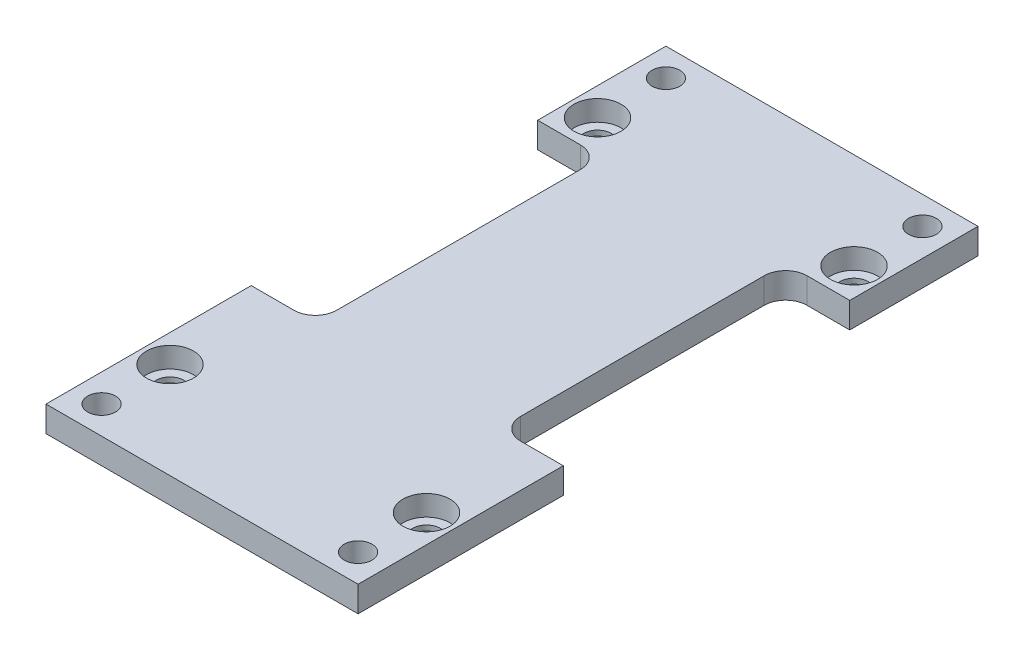
ISO-10303-21;
HEADER;
FILE_DESCRIPTION(('STEP AP214'),'2;1');
FILE_NAME('part.step','',(''),(''),'','','');
FILE_SCHEMA(('AUTOMOTIVE_DESIGN { 1 0 10303 214 1 1 1 1 }'));
ENDSEC;
DATA;
#1=APPLICATION_CONTEXT('core data for automotive mechanical design processes');
#2=APPLICATION_PROTOCOL_DEFINITION('international standard','automotive_design',2000,#1);
#3=PRODUCT_CONTEXT('',#1,'mechanical');
#4=PRODUCT('Part','Part','',(#3));
#5=PRODUCT_RELATED_PRODUCT_CATEGORY('part','',(#4));
#6=PRODUCT_DEFINITION_FORMATION('','',#4);
#7=PRODUCT_DEFINITION_CONTEXT('part definition',#1,'design');
#8=PRODUCT_DEFINITION('design','',#6,#7);
#9=PRODUCT_DEFINITION_SHAPE('','',#8);
#10=(LENGTH_UNIT() NAMED_UNIT(*) SI_UNIT(.MILLI.,.METRE.));
#11=(NAMED_UNIT(*) PLANE_ANGLE_UNIT() SI_UNIT($,.RADIAN.));
#12=(NAMED_UNIT(*) SI_UNIT($,.STERADIAN.) SOLID_ANGLE_UNIT());
#13=UNCERTAINTY_MEASURE_WITH_UNIT(LENGTH_MEASURE(1.E-05),#10,'distance_accuracy_value','');
#14=(GEOMETRIC_REPRESENTATION_CONTEXT(3) GLOBAL_UNCERTAINTY_ASSIGNED_CONTEXT((#13)) GLOBAL_UNIT_ASSIGNED_CONTEXT((#10,
#11,#12)) REPRESENTATION_CONTEXT('',''));
#15=CARTESIAN_POINT('',(0.,0.,0.));
#16=DIRECTION('',(0.,0.,1.));
#17=DIRECTION('',(1.,0.,0.));
#18=AXIS2_PLACEMENT_3D('',#15,#16,#17);
#19=CARTESIAN_POINT('',(-30.,0.,-50.));
#20=DIRECTION('',(0.,1.,0.));
#21=DIRECTION('',(0.,0.,1.));
#22=AXIS2_PLACEMENT_3D('',#19,#20,#21);
#23=CYLINDRICAL_SURFACE('',#22,3.25000000000001);
#24=CARTESIAN_POINT('',(-30.,0.,-50.));
#25=DIRECTION('',(0.,1.,0.));
#26=DIRECTION('',(0.,0.,1.));
#27=AXIS2_PLACEMENT_3D('',#24,#25,#26);
#28=CIRCLE('',#27,3.25000000000001);
#29=CARTESIAN_POINT('',(-30.,0.,-46.75));
#30=VERTEX_POINT('',#29);
#31=EDGE_CURVE('E346',#30,#30,#28,.T.);
#32=ORIENTED_EDGE('',*,*,#31,.F.);
#33=EDGE_LOOP('',(#32));
#34=FACE_BOUND('',#33,.T.);
#35=CARTESIAN_POINT('',(-30.,1.2,-50.));
#36=DIRECTION('',(0.,1.,0.));
#37=DIRECTION('',(0.,0.,1.));
#38=AXIS2_PLACEMENT_3D('',#35,#36,#37);
#39=CIRCLE('',#38,3.25000000000001);
#40=CARTESIAN_POINT('',(-30.,1.2,-46.75));
#41=VERTEX_POINT('',#40);
#42=EDGE_CURVE('E304',#41,#41,#39,.F.);
#43=ORIENTED_EDGE('',*,*,#42,.F.);
#44=EDGE_LOOP('',(#43));
#45=FACE_BOUND('',#44,.T.);
#46=ADVANCED_FACE('F44',(#34,#45),#23,.F.);
#47=CARTESIAN_POINT('',(30.,0.,50.));
#48=DIRECTION('',(0.,1.,0.));
#49=DIRECTION('',(0.,0.,1.));
#50=AXIS2_PLACEMENT_3D('',#47,#48,#49);
#51=CYLINDRICAL_SURFACE('',#50,3.25000000000001);
#52=CARTESIAN_POINT('',(30.,0.,50.));
#53=DIRECTION('',(0.,1.,0.));
#54=DIRECTION('',(0.,0.,1.));
#55=AXIS2_PLACEMENT_3D('',#52,#53,#54);
#56=CIRCLE('',#55,3.25000000000001);
#57=CARTESIAN_POINT('',(30.,0.,53.25));
#58=VERTEX_POINT('',#57);
#59=EDGE_CURVE('E327',#58,#58,#56,.T.);
#60=ORIENTED_EDGE('',*,*,#59,.F.);
#61=EDGE_LOOP('',(#60));
#62=FACE_BOUND('',#61,.T.);
#63=CARTESIAN_POINT('',(30.,1.2,50.));
#64=DIRECTION('',(0.,1.,0.));
#65=DIRECTION('',(0.,0.,1.));
#66=AXIS2_PLACEMENT_3D('',#63,#64,#65);
#67=CIRCLE('',#66,3.25000000000001);
#68=CARTESIAN_POINT('',(30.,1.2,53.25));
#69=VERTEX_POINT('',#68);
#70=EDGE_CURVE('E294',#69,#69,#67,.F.);
#71=ORIENTED_EDGE('',*,*,#70,.F.);
#72=EDGE_LOOP('',(#71));
#73=FACE_BOUND('',#72,.T.);
#74=ADVANCED_FACE('F426',(#62,#73),#51,.F.);
#75=CARTESIAN_POINT('',(36.5,6.,-42.5));
#76=DIRECTION('',(-1.,0.,0.));
#77=DIRECTION('',(0.,0.,1.));
#78=AXIS2_PLACEMENT_3D('',#75,#76,#77);
#79=PLANE('',#78);
#80=DIRECTION('',(0.,0.,-1.));
#81=VECTOR('',#80,1.);
#82=CARTESIAN_POINT('',(36.5,0.,-42.5));
#83=LINE('',#82,#81);
#84=CARTESIAN_POINT('',(36.5,0.,-42.5));
#85=VERTEX_POINT('',#84);
#86=CARTESIAN_POINT('',(36.5,0.,-72.5));
#87=VERTEX_POINT('',#86);
#88=EDGE_CURVE('E197',#85,#87,#83,.T.);
#89=ORIENTED_EDGE('',*,*,#88,.T.);
#90=DIRECTION('',(0.,-1.,0.));
#91=VECTOR('',#90,1.);
#92=CARTESIAN_POINT('',(36.5,6.,-72.5));
#93=LINE('',#92,#91);
#94=CARTESIAN_POINT('',(36.5,6.,-72.5));
#95=VERTEX_POINT('',#94);
#96=EDGE_CURVE('E11',#95,#87,#93,.T.);
#97=ORIENTED_EDGE('',*,*,#96,.F.);
#98=DIRECTION('',(0.,0.,-1.));
#99=VECTOR('',#98,1.);
#100=CARTESIAN_POINT('',(36.5,6.,-42.5));
#101=LINE('',#100,#99);
#102=CARTESIAN_POINT('',(36.5,6.,-42.5));
#103=VERTEX_POINT('',#102);
#104=EDGE_CURVE('E243',#103,#95,#101,.T.);
#105=ORIENTED_EDGE('',*,*,#104,.F.);
#106=DIRECTION('',(0.,-1.,0.));
#107=VECTOR('',#106,1.);
#108=CARTESIAN_POINT('',(36.5,6.,-42.5));
#109=LINE('',#108,#107);
#110=EDGE_CURVE('E195',#103,#85,#109,.T.);
#111=ORIENTED_EDGE('',*,*,#110,.T.);
#112=EDGE_LOOP('',(#89,#97,#105,#111));
#113=FACE_BOUND('',#112,.T.);
#114=ADVANCED_FACE('F50',(#113),#79,.F.);
#115=CARTESIAN_POINT('',(-36.5,6.,-72.5));
#116=DIRECTION('',(0.,0.,1.));
#117=DIRECTION('',(1.,0.,0.));
#118=AXIS2_PLACEMENT_3D('',#115,#116,#117);
#119=PLANE('',#118);
#120=DIRECTION('',(-1.,0.,0.));
#121=VECTOR('',#120,1.);
#122=CARTESIAN_POINT('',(-36.5,0.,-72.5));
#123=LINE('',#122,#121);
#124=CARTESIAN_POINT('',(-36.5,0.,-72.5));
#125=VERTEX_POINT('',#124);
#126=EDGE_CURVE('E203',#87,#125,#123,.T.);
#127=ORIENTED_EDGE('',*,*,#126,.T.);
#128=DIRECTION('',(0.,-1.,0.));
#129=VECTOR('',#128,1.);
#130=CARTESIAN_POINT('',(-36.5,6.,-72.5));
#131=LINE('',#130,#129);
#132=CARTESIAN_POINT('',(-36.5,6.,-72.5));
#133=VERTEX_POINT('',#132);
#134=EDGE_CURVE('E57',#133,#125,#131,.T.);
#135=ORIENTED_EDGE('',*,*,#134,.F.);
#136=DIRECTION('',(-1.,0.,0.));
#137=VECTOR('',#136,1.);
#138=CARTESIAN_POINT('',(-36.5,6.,-72.5));
#139=LINE('',#138,#137);
#140=EDGE_CURVE('E135',#95,#133,#139,.T.);
#141=ORIENTED_EDGE('',*,*,#140,.F.);
#142=ORIENTED_EDGE('',*,*,#96,.T.);
#143=EDGE_LOOP('',(#127,#135,#141,#142));
#144=FACE_BOUND('',#143,.T.);
#145=ADVANCED_FACE('F794',(#144),#119,.F.);
#146=CARTESIAN_POINT('',(-36.5,6.,-42.5));
#147=DIRECTION('',(1.,0.,0.));
#148=DIRECTION('',(0.,0.,-1.));
#149=AXIS2_PLACEMENT_3D('',#146,#147,#148);
#150=PLANE('',#149);
#151=DIRECTION('',(0.,0.,1.));
#152=VECTOR('',#151,1.);
#153=CARTESIAN_POINT('',(-36.5,0.,-42.5));
#154=LINE('',#153,#152);
#155=CARTESIAN_POINT('',(-36.5,0.,-42.5));
#156=VERTEX_POINT('',#155);
#157=EDGE_CURVE('E202',#125,#156,#154,.T.);
#158=ORIENTED_EDGE('',*,*,#157,.T.);
#159=DIRECTION('',(0.,-1.,0.));
#160=VECTOR('',#159,1.);
#161=CARTESIAN_POINT('',(-36.5,6.,-42.5));
#162=LINE('',#161,#160);
#163=CARTESIAN_POINT('',(-36.5,6.,-42.5));
#164=VERTEX_POINT('',#163);
#165=EDGE_CURVE('E289',#164,#156,#162,.T.);
#166=ORIENTED_EDGE('',*,*,#165,.F.);
#167=DIRECTION('',(0.,0.,1.));
#168=VECTOR('',#167,1.);
#169=CARTESIAN_POINT('',(-36.5,6.,-42.5));
#170=LINE('',#169,#168);
#171=EDGE_CURVE('E368',#133,#164,#170,.T.);
#172=ORIENTED_EDGE('',*,*,#171,.F.);
#173=ORIENTED_EDGE('',*,*,#134,.T.);
#174=EDGE_LOOP('',(#158,#166,#172,#173));
#175=FACE_BOUND('',#174,.T.);
#176=ADVANCED_FACE('F783',(#175),#150,.F.);
#177=CARTESIAN_POINT('',(-36.5,6.,-42.5));
#178=DIRECTION('',(0.,0.,-1.));
#179=DIRECTION('',(-1.,0.,0.));
#180=AXIS2_PLACEMENT_3D('',#177,#178,#179);
#181=PLANE('',#180);
#182=DIRECTION('',(1.,0.,0.));
#183=VECTOR('',#182,1.);
#184=CARTESIAN_POINT('',(-36.5,0.,-42.5));
#185=LINE('',#184,#183);
#186=CARTESIAN_POINT('',(-26.5,0.,-42.5));
#187=VERTEX_POINT('',#186);
#188=EDGE_CURVE('E208',#156,#187,#185,.T.);
#189=ORIENTED_EDGE('',*,*,#188,.T.);
#190=DIRECTION('',(0.,-1.,0.));
#191=VECTOR('',#190,1.);
#192=CARTESIAN_POINT('',(-26.5,6.,-42.5));
#193=LINE('',#192,#191);
#194=CARTESIAN_POINT('',(-26.5,6.,-42.5));
#195=VERTEX_POINT('',#194);
#196=EDGE_CURVE('E282',#195,#187,#193,.T.);
#197=ORIENTED_EDGE('',*,*,#196,.F.);
#198=DIRECTION('',(1.,0.,0.));
#199=VECTOR('',#198,1.);
#200=CARTESIAN_POINT('',(-36.5,6.,-42.5));
#201=LINE('',#200,#199);
#202=EDGE_CURVE('E369',#164,#195,#201,.T.);
#203=ORIENTED_EDGE('',*,*,#202,.F.);
#204=ORIENTED_EDGE('',*,*,#165,.T.);
#205=EDGE_LOOP('',(#189,#197,#203,#204));
#206=FACE_BOUND('',#205,.T.);
#207=ADVANCED_FACE('F773',(#206),#181,.F.);
#208=CARTESIAN_POINT('',(-26.5,6.,-37.5));
#209=DIRECTION('',(0.,-1.,0.));
#210=DIRECTION('',(0.,0.,-1.));
#211=AXIS2_PLACEMENT_3D('',#208,#209,#210);
#212=CYLINDRICAL_SURFACE('',#211,5.);
#213=CARTESIAN_POINT('',(-26.5,0.,-37.5));
#214=DIRECTION('',(0.,-1.,0.));
#215=DIRECTION('',(0.,0.,-1.));
#216=AXIS2_PLACEMENT_3D('',#213,#214,#215);
#217=CIRCLE('',#216,5.);
#218=CARTESIAN_POINT('',(-21.5,0.,-37.5));
#219=VERTEX_POINT('',#218);
#220=EDGE_CURVE('E211',#187,#219,#217,.T.);
#221=ORIENTED_EDGE('',*,*,#220,.T.);
#222=DIRECTION('',(0.,-1.,0.));
#223=VECTOR('',#222,1.);
#224=CARTESIAN_POINT('',(-21.5,6.,-37.5));
#225=LINE('',#224,#223);
#226=CARTESIAN_POINT('',(-21.5,6.,-37.5));
#227=VERTEX_POINT('',#226);
#228=EDGE_CURVE('E276',#227,#219,#225,.T.);
#229=ORIENTED_EDGE('',*,*,#228,.F.);
#230=CARTESIAN_POINT('',(-26.5,6.,-37.5));
#231=DIRECTION('',(0.,-1.,0.));
#232=DIRECTION('',(0.,0.,-1.));
#233=AXIS2_PLACEMENT_3D('',#230,#231,#232);
#234=CIRCLE('',#233,5.);
#235=EDGE_CURVE('E375',#195,#227,#234,.T.);
#236=ORIENTED_EDGE('',*,*,#235,.F.);
#237=ORIENTED_EDGE('',*,*,#196,.T.);
#238=EDGE_LOOP('',(#221,#229,#236,#237));
#239=FACE_BOUND('',#238,.T.);
#240=ADVANCED_FACE('F764',(#239),#212,.F.);
#241=CARTESIAN_POINT('',(-21.5,6.,-37.5));
#242=DIRECTION('',(1.,0.,0.));
#243=DIRECTION('',(0.,0.,-1.));
#244=AXIS2_PLACEMENT_3D('',#241,#242,#243);
#245=PLANE('',#244);
#246=DIRECTION('',(0.,0.,1.));
#247=VECTOR('',#246,1.);
#248=CARTESIAN_POINT('',(-21.5,0.,-37.5));
#249=LINE('',#248,#247);
#250=CARTESIAN_POINT('',(-21.5,0.,19.5));
#251=VERTEX_POINT('',#250);
#252=EDGE_CURVE('E212',#219,#251,#249,.T.);
#253=ORIENTED_EDGE('',*,*,#252,.T.);
#254=DIRECTION('',(0.,-1.,0.));
#255=VECTOR('',#254,1.);
#256=CARTESIAN_POINT('',(-21.5,6.,19.5));
#257=LINE('',#256,#255);
#258=CARTESIAN_POINT('',(-21.5,6.,19.5));
#259=VERTEX_POINT('',#258);
#260=EDGE_CURVE('E274',#259,#251,#257,.T.);
#261=ORIENTED_EDGE('',*,*,#260,.F.);
#262=DIRECTION('',(0.,0.,1.));
#263=VECTOR('',#262,1.);
#264=CARTESIAN_POINT('',(-21.5,6.,-37.5));
#265=LINE('',#264,#263);
#266=EDGE_CURVE('E374',#227,#259,#265,.T.);
#267=ORIENTED_EDGE('',*,*,#266,.F.);
#268=ORIENTED_EDGE('',*,*,#228,.T.);
#269=EDGE_LOOP('',(#253,#261,#267,#268));
#270=FACE_BOUND('',#269,.T.);
#271=ADVANCED_FACE('F752',(#270),#245,.F.);
#272=CARTESIAN_POINT('',(-26.5,6.,19.5));
#273=DIRECTION('',(0.,-1.,0.));
#274=DIRECTION('',(0.,0.,-1.));
#275=AXIS2_PLACEMENT_3D('',#272,#273,#274);
#276=CYLINDRICAL_SURFACE('',#275,5.);
#277=CARTESIAN_POINT('',(-26.5,0.,19.5));
#278=DIRECTION('',(0.,-1.,0.));
#279=DIRECTION('',(0.,0.,-1.));
#280=AXIS2_PLACEMENT_3D('',#277,#278,#279);
#281=CIRCLE('',#280,5.);
#282=CARTESIAN_POINT('',(-26.5,0.,24.5));
#283=VERTEX_POINT('',#282);
#284=EDGE_CURVE('E220',#251,#283,#281,.T.);
#285=ORIENTED_EDGE('',*,*,#284,.T.);
#286=DIRECTION('',(0.,-1.,0.));
#287=VECTOR('',#286,1.);
#288=CARTESIAN_POINT('',(-26.5,6.,24.5));
#289=LINE('',#288,#287);
#290=CARTESIAN_POINT('',(-26.5,6.,24.5));
#291=VERTEX_POINT('',#290);
#292=EDGE_CURVE('E271',#291,#283,#289,.T.);
#293=ORIENTED_EDGE('',*,*,#292,.F.);
#294=CARTESIAN_POINT('',(-26.5,6.,19.5));
#295=DIRECTION('',(0.,-1.,0.));
#296=DIRECTION('',(0.,0.,-1.));
#297=AXIS2_PLACEMENT_3D('',#294,#295,#296);
#298=CIRCLE('',#297,5.);
#299=EDGE_CURVE('E378',#259,#291,#298,.T.);
#300=ORIENTED_EDGE('',*,*,#299,.F.);
#301=ORIENTED_EDGE('',*,*,#260,.T.);
#302=EDGE_LOOP('',(#285,#293,#300,#301));
#303=FACE_BOUND('',#302,.T.);
#304=ADVANCED_FACE('F743',(#303),#276,.F.);
#305=CARTESIAN_POINT('',(-26.5,6.,24.5));
#306=DIRECTION('',(0.,0.,1.));
#307=DIRECTION('',(1.,0.,0.));
#308=AXIS2_PLACEMENT_3D('',#305,#306,#307);
#309=PLANE('',#308);
#310=DIRECTION('',(-1.,0.,0.));
#311=VECTOR('',#310,1.);
#312=CARTESIAN_POINT('',(-26.5,0.,24.5));
#313=LINE('',#312,#311);
#314=CARTESIAN_POINT('',(-36.5,0.,24.5));
#315=VERTEX_POINT('',#314);
#316=EDGE_CURVE('E219',#283,#315,#313,.T.);
#317=ORIENTED_EDGE('',*,*,#316,.T.);
#318=DIRECTION('',(0.,-1.,0.));
#319=VECTOR('',#318,1.);
#320=CARTESIAN_POINT('',(-36.5,6.,24.5));
#321=LINE('',#320,#319);
#322=CARTESIAN_POINT('',(-36.5,6.,24.5));
#323=VERTEX_POINT('',#322);
#324=EDGE_CURVE('E270',#323,#315,#321,.T.);
#325=ORIENTED_EDGE('',*,*,#324,.F.);
#326=DIRECTION('',(-1.,0.,0.));
#327=VECTOR('',#326,1.);
#328=CARTESIAN_POINT('',(-26.5,6.,24.5));
#329=LINE('',#328,#327);
#330=EDGE_CURVE('E381',#291,#323,#329,.T.);
#331=ORIENTED_EDGE('',*,*,#330,.F.);
#332=ORIENTED_EDGE('',*,*,#292,.T.);
#333=EDGE_LOOP('',(#317,#325,#331,#332));
#334=FACE_BOUND('',#333,.T.);
#335=ADVANCED_FACE('F733',(#334),#309,.F.);
#336=CARTESIAN_POINT('',(-36.5,6.,24.5));
#337=DIRECTION('',(1.,0.,0.));
#338=DIRECTION('',(0.,0.,-1.));
#339=AXIS2_PLACEMENT_3D('',#336,#337,#338);
#340=PLANE('',#339);
#341=DIRECTION('',(0.,0.,1.));
#342=VECTOR('',#341,1.);
#343=CARTESIAN_POINT('',(-36.5,0.,24.5));
#344=LINE('',#343,#342);
#345=CARTESIAN_POINT('',(-36.5,0.,72.5));
#346=VERTEX_POINT('',#345);
#347=EDGE_CURVE('E224',#315,#346,#344,.T.);
#348=ORIENTED_EDGE('',*,*,#347,.T.);
#349=DIRECTION('',(0.,-1.,0.));
#350=VECTOR('',#349,1.);
#351=CARTESIAN_POINT('',(-36.5,6.,72.5));
#352=LINE('',#351,#350);
#353=CARTESIAN_POINT('',(-36.5,6.,72.5));
#354=VERTEX_POINT('',#353);
#355=EDGE_CURVE('E263',#354,#346,#352,.T.);
#356=ORIENTED_EDGE('',*,*,#355,.F.);
#357=DIRECTION('',(0.,0.,1.));
#358=VECTOR('',#357,1.);
#359=CARTESIAN_POINT('',(-36.5,6.,24.5));
#360=LINE('',#359,#358);
#361=EDGE_CURVE('E383',#323,#354,#360,.T.);
#362=ORIENTED_EDGE('',*,*,#361,.F.);
#363=ORIENTED_EDGE('',*,*,#324,.T.);
#364=EDGE_LOOP('',(#348,#356,#362,#363));
#365=FACE_BOUND('',#364,.T.);
#366=ADVANCED_FACE('F724',(#365),#340,.F.);
#367=CARTESIAN_POINT('',(-36.5,6.,72.5));
#368=DIRECTION('',(0.,0.,-1.));
#369=DIRECTION('',(-1.,0.,0.));
#370=AXIS2_PLACEMENT_3D('',#367,#368,#369);
#371=PLANE('',#370);
#372=DIRECTION('',(1.,0.,0.));
#373=VECTOR('',#372,1.);
#374=CARTESIAN_POINT('',(-36.5,0.,72.5));
#375=LINE('',#374,#373);
#376=CARTESIAN_POINT('',(36.5,0.,72.5));
#377=VERTEX_POINT('',#376);
#378=EDGE_CURVE('E226',#346,#377,#375,.T.);
#379=ORIENTED_EDGE('',*,*,#378,.T.);
#380=DIRECTION('',(0.,-1.,0.));
#381=VECTOR('',#380,1.);
#382=CARTESIAN_POINT('',(36.5,6.,72.5));
#383=LINE('',#382,#381);
#384=CARTESIAN_POINT('',(36.5,6.,72.5));
#385=VERTEX_POINT('',#384);
#386=EDGE_CURVE('E259',#385,#377,#383,.T.);
#387=ORIENTED_EDGE('',*,*,#386,.F.);
#388=DIRECTION('',(1.,0.,0.));
#389=VECTOR('',#388,1.);
#390=CARTESIAN_POINT('',(-36.5,6.,72.5));
#391=LINE('',#390,#389);
#392=EDGE_CURVE('E390',#354,#385,#391,.T.);
#393=ORIENTED_EDGE('',*,*,#392,.F.);
#394=ORIENTED_EDGE('',*,*,#355,.T.);
#395=EDGE_LOOP('',(#379,#387,#393,#394));
#396=FACE_BOUND('',#395,.T.);
#397=ADVANCED_FACE('F714',(#396),#371,.F.);
#398=CARTESIAN_POINT('',(36.5,6.,24.5));
#399=DIRECTION('',(-1.,0.,0.));
#400=DIRECTION('',(0.,0.,1.));
#401=AXIS2_PLACEMENT_3D('',#398,#399,#400);
#402=PLANE('',#401);
#403=DIRECTION('',(0.,0.,-1.));
#404=VECTOR('',#403,1.);
#405=CARTESIAN_POINT('',(36.5,0.,24.5));
#406=LINE('',#405,#404);
#407=CARTESIAN_POINT('',(36.5,0.,24.5));
#408=VERTEX_POINT('',#407);
#409=EDGE_CURVE('E228',#377,#408,#406,.T.);
#410=ORIENTED_EDGE('',*,*,#409,.T.);
#411=DIRECTION('',(0.,-1.,0.));
#412=VECTOR('',#411,1.);
#413=CARTESIAN_POINT('',(36.5,6.,24.5));
#414=LINE('',#413,#412);
#415=CARTESIAN_POINT('',(36.5,6.,24.5));
#416=VERTEX_POINT('',#415);
#417=EDGE_CURVE('E254',#416,#408,#414,.T.);
#418=ORIENTED_EDGE('',*,*,#417,.F.);
#419=DIRECTION('',(0.,0.,-1.));
#420=VECTOR('',#419,1.);
#421=CARTESIAN_POINT('',(36.5,6.,24.5));
#422=LINE('',#421,#420);
#423=EDGE_CURVE('E388',#385,#416,#422,.T.);
#424=ORIENTED_EDGE('',*,*,#423,.F.);
#425=ORIENTED_EDGE('',*,*,#386,.T.);
#426=EDGE_LOOP('',(#410,#418,#424,#425));
#427=FACE_BOUND('',#426,.T.);
#428=ADVANCED_FACE('F706',(#427),#402,.F.);
#429=CARTESIAN_POINT('',(26.5,6.,24.5));
#430=DIRECTION('',(0.,0.,1.));
#431=DIRECTION('',(1.,0.,0.));
#432=AXIS2_PLACEMENT_3D('',#429,#430,#431);
#433=PLANE('',#432);
#434=DIRECTION('',(-1.,0.,0.));
#435=VECTOR('',#434,1.);
#436=CARTESIAN_POINT('',(26.5,0.,24.5));
#437=LINE('',#436,#435);
#438=CARTESIAN_POINT('',(26.5,0.,24.5));
#439=VERTEX_POINT('',#438);
#440=EDGE_CURVE('E234',#408,#439,#437,.T.);
#441=ORIENTED_EDGE('',*,*,#440,.T.);
#442=DIRECTION('',(0.,-1.,0.));
#443=VECTOR('',#442,1.);
#444=CARTESIAN_POINT('',(26.5,6.,24.5));
#445=LINE('',#444,#443);
#446=CARTESIAN_POINT('',(26.5,6.,24.5));
#447=VERTEX_POINT('',#446);
#448=EDGE_CURVE('E253',#447,#439,#445,.T.);
#449=ORIENTED_EDGE('',*,*,#448,.F.);
#450=DIRECTION('',(-1.,0.,0.));
#451=VECTOR('',#450,1.);
#452=CARTESIAN_POINT('',(26.5,6.,24.5));
#453=LINE('',#452,#451);
#454=EDGE_CURVE('E392',#416,#447,#453,.T.);
#455=ORIENTED_EDGE('',*,*,#454,.F.);
#456=ORIENTED_EDGE('',*,*,#417,.T.);
#457=EDGE_LOOP('',(#441,#449,#455,#456));
#458=FACE_BOUND('',#457,.T.);
#459=ADVANCED_FACE('F402',(#458),#433,.F.);
#460=CARTESIAN_POINT('',(26.5,6.,19.5));
#461=DIRECTION('',(0.,-1.,0.));
#462=DIRECTION('',(0.,0.,-1.));
#463=AXIS2_PLACEMENT_3D('',#460,#461,#462);
#464=CYLINDRICAL_SURFACE('',#463,5.);
#465=CARTESIAN_POINT('',(26.5,0.,19.5));
#466=DIRECTION('',(0.,-1.,0.));
#467=DIRECTION('',(0.,0.,-1.));
#468=AXIS2_PLACEMENT_3D('',#465,#466,#467);
#469=CIRCLE('',#468,5.);
#470=CARTESIAN_POINT('',(21.5,0.,19.5));
#471=VERTEX_POINT('',#470);
#472=EDGE_CURVE('E233',#439,#471,#469,.T.);
#473=ORIENTED_EDGE('',*,*,#472,.T.);
#474=DIRECTION('',(0.,-1.,0.));
#475=VECTOR('',#474,1.);
#476=CARTESIAN_POINT('',(21.5,6.,19.5));
#477=LINE('',#476,#475);
#478=CARTESIAN_POINT('',(21.5,6.,19.5));
#479=VERTEX_POINT('',#478);
#480=EDGE_CURVE('E186',#479,#471,#477,.T.);
#481=ORIENTED_EDGE('',*,*,#480,.F.);
#482=CARTESIAN_POINT('',(26.5,6.,19.5));
#483=DIRECTION('',(0.,-1.,0.));
#484=DIRECTION('',(0.,0.,-1.));
#485=AXIS2_PLACEMENT_3D('',#482,#483,#484);
#486=CIRCLE('',#485,5.);
#487=EDGE_CURVE('E174',#447,#479,#486,.T.);
#488=ORIENTED_EDGE('',*,*,#487,.F.);
#489=ORIENTED_EDGE('',*,*,#448,.T.);
#490=EDGE_LOOP('',(#473,#481,#488,#489));
#491=FACE_BOUND('',#490,.T.);
#492=ADVANCED_FACE('F403',(#491),#464,.F.);
#493=CARTESIAN_POINT('',(21.5,6.,-37.5));
#494=DIRECTION('',(-1.,0.,0.));
#495=DIRECTION('',(0.,0.,1.));
#496=AXIS2_PLACEMENT_3D('',#493,#494,#495);
#497=PLANE('',#496);
#498=DIRECTION('',(0.,0.,-1.));
#499=VECTOR('',#498,1.);
#500=CARTESIAN_POINT('',(21.5,0.,-37.5));
#501=LINE('',#500,#499);
#502=CARTESIAN_POINT('',(21.5,0.,-37.5));
#503=VERTEX_POINT('',#502);
#504=EDGE_CURVE('E184',#471,#503,#501,.T.);
#505=ORIENTED_EDGE('',*,*,#504,.T.);
#506=DIRECTION('',(0.,-1.,0.));
#507=VECTOR('',#506,1.);
#508=CARTESIAN_POINT('',(21.5,6.,-37.5));
#509=LINE('',#508,#507);
#510=CARTESIAN_POINT('',(21.5,6.,-37.5));
#511=VERTEX_POINT('',#510);
#512=EDGE_CURVE('E182',#511,#503,#509,.T.);
#513=ORIENTED_EDGE('',*,*,#512,.F.);
#514=DIRECTION('',(0.,0.,-1.));
#515=VECTOR('',#514,1.);
#516=CARTESIAN_POINT('',(21.5,6.,-37.5));
#517=LINE('',#516,#515);
#518=EDGE_CURVE('E166',#479,#511,#517,.T.);
#519=ORIENTED_EDGE('',*,*,#518,.F.);
#520=ORIENTED_EDGE('',*,*,#480,.T.);
#521=EDGE_LOOP('',(#505,#513,#519,#520));
#522=FACE_BOUND('',#521,.T.);
#523=ADVANCED_FACE('F185',(#522),#497,.F.);
#524=CARTESIAN_POINT('',(26.5,6.,-37.5));
#525=DIRECTION('',(0.,-1.,0.));
#526=DIRECTION('',(0.,0.,-1.));
#527=AXIS2_PLACEMENT_3D('',#524,#525,#526);
#528=CYLINDRICAL_SURFACE('',#527,5.);
#529=CARTESIAN_POINT('',(26.5,0.,-37.5));
#530=DIRECTION('',(0.,-1.,0.));
#531=DIRECTION('',(0.,0.,-1.));
#532=AXIS2_PLACEMENT_3D('',#529,#530,#531);
#533=CIRCLE('',#532,5.);
#534=CARTESIAN_POINT('',(26.5,0.,-42.5));
#535=VERTEX_POINT('',#534);
#536=EDGE_CURVE('E117',#503,#535,#533,.T.);
#537=ORIENTED_EDGE('',*,*,#536,.T.);
#538=DIRECTION('',(0.,-1.,0.));
#539=VECTOR('',#538,1.);
#540=CARTESIAN_POINT('',(26.5,6.,-42.5));
#541=LINE('',#540,#539);
#542=CARTESIAN_POINT('',(26.5,6.,-42.5));
#543=VERTEX_POINT('',#542);
#544=EDGE_CURVE('E190',#543,#535,#541,.T.);
#545=ORIENTED_EDGE('',*,*,#544,.F.);
#546=CARTESIAN_POINT('',(26.5,6.,-37.5));
#547=DIRECTION('',(0.,-1.,0.));
#548=DIRECTION('',(0.,0.,-1.));
#549=AXIS2_PLACEMENT_3D('',#546,#547,#548);
#550=CIRCLE('',#549,5.);
#551=EDGE_CURVE('E172',#511,#543,#550,.T.);
#552=ORIENTED_EDGE('',*,*,#551,.F.);
#553=ORIENTED_EDGE('',*,*,#512,.T.);
#554=EDGE_LOOP('',(#537,#545,#552,#553));
#555=FACE_BOUND('',#554,.T.);
#556=ADVANCED_FACE('F188',(#555),#528,.F.);
#557=CARTESIAN_POINT('',(36.5,6.,-42.5));
#558=DIRECTION('',(0.,0.,-1.));
#559=DIRECTION('',(-1.,0.,0.));
#560=AXIS2_PLACEMENT_3D('',#557,#558,#559);
#561=PLANE('',#560);
#562=DIRECTION('',(1.,0.,0.));
#563=VECTOR('',#562,1.);
#564=CARTESIAN_POINT('',(36.5,0.,-42.5));
#565=LINE('',#564,#563);
#566=EDGE_CURVE('E121',#535,#85,#565,.T.);
#567=ORIENTED_EDGE('',*,*,#566,.T.);
#568=ORIENTED_EDGE('',*,*,#110,.F.);
#569=DIRECTION('',(1.,0.,0.));
#570=VECTOR('',#569,1.);
#571=CARTESIAN_POINT('',(36.5,6.,-42.5));
#572=LINE('',#571,#570);
#573=EDGE_CURVE('E64',#543,#103,#572,.T.);
#574=ORIENTED_EDGE('',*,*,#573,.F.);
#575=ORIENTED_EDGE('',*,*,#544,.T.);
#576=EDGE_LOOP('',(#567,#568,#574,#575));
#577=FACE_BOUND('',#576,.T.);
#578=ADVANCED_FACE('F415',(#577),#561,.F.);
#579=CARTESIAN_POINT('',(-26.5,6.,-37.5));
#580=DIRECTION('',(0.,-1.,0.));
#581=DIRECTION('',(0.,0.,-1.));
#582=AXIS2_PLACEMENT_3D('',#579,#580,#581);
#583=PLANE('',#582);
#584=CARTESIAN_POINT('',(-30.,6.,50.));
#585=DIRECTION('',(0.,1.,0.));
#586=DIRECTION('',(0.,0.,-1.));
#587=AXIS2_PLACEMENT_3D('',#584,#585,#586);
#588=CIRCLE('',#587,5.5);
#589=CARTESIAN_POINT('',(-30.,6.,44.5));
#590=VERTEX_POINT('',#589);
#591=EDGE_CURVE('E604',#590,#590,#588,.T.);
#592=ORIENTED_EDGE('',*,*,#591,.F.);
#593=EDGE_LOOP('',(#592));
#594=FACE_BOUND('',#593,.T.);
#595=CARTESIAN_POINT('',(30.,6.,50.));
#596=DIRECTION('',(0.,1.,0.));
#597=DIRECTION('',(0.,0.,1.));
#598=AXIS2_PLACEMENT_3D('',#595,#596,#597);
#599=CIRCLE('',#598,5.5);
#600=CARTESIAN_POINT('',(30.,6.,55.5));
#601=VERTEX_POINT('',#600);
#602=EDGE_CURVE('E615',#601,#601,#599,.T.);
#603=ORIENTED_EDGE('',*,*,#602,.F.);
#604=EDGE_LOOP('',(#603));
#605=FACE_BOUND('',#604,.T.);
#606=CARTESIAN_POINT('',(30.,6.,-50.));
#607=DIRECTION('',(0.,1.,0.));
#608=DIRECTION('',(0.,0.,-1.));
#609=AXIS2_PLACEMENT_3D('',#606,#607,#608);
#610=CIRCLE('',#609,5.5);
#611=CARTESIAN_POINT('',(30.,6.,-55.5));
#612=VERTEX_POINT('',#611);
#613=EDGE_CURVE('E625',#612,#612,#610,.T.);
#614=ORIENTED_EDGE('',*,*,#613,.F.);
#615=EDGE_LOOP('',(#614));
#616=FACE_BOUND('',#615,.T.);
#617=CARTESIAN_POINT('',(-30.,6.,-50.));
#618=DIRECTION('',(0.,1.,0.));
#619=DIRECTION('',(0.,0.,1.));
#620=AXIS2_PLACEMENT_3D('',#617,#618,#619);
#621=CIRCLE('',#620,5.5);
#622=CARTESIAN_POINT('',(-30.,6.,-44.5));
#623=VERTEX_POINT('',#622);
#624=EDGE_CURVE('E616',#623,#623,#621,.T.);
#625=ORIENTED_EDGE('',*,*,#624,.F.);
#626=EDGE_LOOP('',(#625));
#627=FACE_BOUND('',#626,.T.);
#628=CARTESIAN_POINT('',(30.,6.,-66.));
#629=DIRECTION('',(0.,1.,0.));
#630=DIRECTION('',(0.,0.,-1.));
#631=AXIS2_PLACEMENT_3D('',#628,#629,#630);
#632=CIRCLE('',#631,3.25);
#633=CARTESIAN_POINT('',(30.,6.,-69.25));
#634=VERTEX_POINT('',#633);
#635=EDGE_CURVE('E336',#634,#634,#632,.T.);
#636=ORIENTED_EDGE('',*,*,#635,.F.);
#637=EDGE_LOOP('',(#636));
#638=FACE_BOUND('',#637,.T.);
#639=CARTESIAN_POINT('',(-30.,6.,66.));
#640=DIRECTION('',(0.,1.,0.));
#641=DIRECTION('',(0.,0.,-1.));
#642=AXIS2_PLACEMENT_3D('',#639,#640,#641);
#643=CIRCLE('',#642,3.25);
#644=CARTESIAN_POINT('',(-30.,6.,62.75));
#645=VERTEX_POINT('',#644);
#646=EDGE_CURVE('E314',#645,#645,#643,.T.);
#647=ORIENTED_EDGE('',*,*,#646,.F.);
#648=EDGE_LOOP('',(#647));
#649=FACE_BOUND('',#648,.T.);
#650=CARTESIAN_POINT('',(30.,6.,66.));
#651=DIRECTION('',(0.,1.,0.));
#652=DIRECTION('',(0.,0.,1.));
#653=AXIS2_PLACEMENT_3D('',#650,#651,#652);
#654=CIRCLE('',#653,3.25);
#655=CARTESIAN_POINT('',(30.,6.,69.25));
#656=VERTEX_POINT('',#655);
#657=EDGE_CURVE('E322',#656,#656,#654,.T.);
#658=ORIENTED_EDGE('',*,*,#657,.F.);
#659=EDGE_LOOP('',(#658));
#660=FACE_BOUND('',#659,.T.);
#661=CARTESIAN_POINT('',(-30.,6.,-66.));
#662=DIRECTION('',(0.,1.,0.));
#663=DIRECTION('',(0.,0.,1.));
#664=AXIS2_PLACEMENT_3D('',#661,#662,#663);
#665=CIRCLE('',#664,3.25);
#666=CARTESIAN_POINT('',(-30.,6.,-62.75));
#667=VERTEX_POINT('',#666);
#668=EDGE_CURVE('E355',#667,#667,#665,.T.);
#669=ORIENTED_EDGE('',*,*,#668,.F.);
#670=EDGE_LOOP('',(#669));
#671=FACE_BOUND('',#670,.T.);
#672=ORIENTED_EDGE('',*,*,#104,.T.);
#673=ORIENTED_EDGE('',*,*,#140,.T.);
#674=ORIENTED_EDGE('',*,*,#171,.T.);
#675=ORIENTED_EDGE('',*,*,#202,.T.);
#676=ORIENTED_EDGE('',*,*,#235,.T.);
#677=ORIENTED_EDGE('',*,*,#266,.T.);
#678=ORIENTED_EDGE('',*,*,#299,.T.);
#679=ORIENTED_EDGE('',*,*,#330,.T.);
#680=ORIENTED_EDGE('',*,*,#361,.T.);
#681=ORIENTED_EDGE('',*,*,#392,.T.);
#682=ORIENTED_EDGE('',*,*,#423,.T.);
#683=ORIENTED_EDGE('',*,*,#454,.T.);
#684=ORIENTED_EDGE('',*,*,#487,.T.);
#685=ORIENTED_EDGE('',*,*,#518,.T.);
#686=ORIENTED_EDGE('',*,*,#551,.T.);
#687=ORIENTED_EDGE('',*,*,#573,.T.);
#688=EDGE_LOOP('',(#672,#673,#674,#675,#676,#677,#678,#679,#680,#681,#682,#683,#684,#685,#686,#687));
#689=FACE_BOUND('',#688,.T.);
#690=ADVANCED_FACE('F171',(#594,#605,#616,#627,#638,#649,#660,#671,#689),#583,.F.);
#691=CARTESIAN_POINT('',(-26.5,0.,-37.5));
#692=DIRECTION('',(0.,-1.,0.));
#693=DIRECTION('',(0.,0.,-1.));
#694=AXIS2_PLACEMENT_3D('',#691,#692,#693);
#695=PLANE('',#694);
#696=ORIENTED_EDGE('',*,*,#59,.T.);
#697=EDGE_LOOP('',(#696));
#698=FACE_BOUND('',#697,.T.);
#699=CARTESIAN_POINT('',(30.,0.,-66.));
#700=DIRECTION('',(0.,1.,0.));
#701=DIRECTION('',(0.,0.,-1.));
#702=AXIS2_PLACEMENT_3D('',#699,#700,#701);
#703=CIRCLE('',#702,3.25);
#704=CARTESIAN_POINT('',(30.,0.,-69.25));
#705=VERTEX_POINT('',#704);
#706=EDGE_CURVE('E342',#705,#705,#703,.T.);
#707=ORIENTED_EDGE('',*,*,#706,.T.);
#708=EDGE_LOOP('',(#707));
#709=FACE_BOUND('',#708,.T.);
#710=CARTESIAN_POINT('',(30.,0.,-50.));
#711=DIRECTION('',(0.,1.,0.));
#712=DIRECTION('',(0.,0.,-1.));
#713=AXIS2_PLACEMENT_3D('',#710,#711,#712);
#714=CIRCLE('',#713,3.25000000000001);
#715=CARTESIAN_POINT('',(30.,0.,-53.25));
#716=VERTEX_POINT('',#715);
#717=EDGE_CURVE('E339',#716,#716,#714,.T.);
#718=ORIENTED_EDGE('',*,*,#717,.T.);
#719=EDGE_LOOP('',(#718));
#720=FACE_BOUND('',#719,.T.);
#721=ORIENTED_EDGE('',*,*,#31,.T.);
#722=EDGE_LOOP('',(#721));
#723=FACE_BOUND('',#722,.T.);
#724=CARTESIAN_POINT('',(-30.,0.,66.));
#725=DIRECTION('',(0.,1.,0.));
#726=DIRECTION('',(0.,0.,-1.));
#727=AXIS2_PLACEMENT_3D('',#724,#725,#726);
#728=CIRCLE('',#727,3.25);
#729=CARTESIAN_POINT('',(-30.,0.,62.75));
#730=VERTEX_POINT('',#729);
#731=EDGE_CURVE('E310',#730,#730,#728,.T.);
#732=ORIENTED_EDGE('',*,*,#731,.T.);
#733=EDGE_LOOP('',(#732));
#734=FACE_BOUND('',#733,.T.);
#735=CARTESIAN_POINT('',(-30.,0.,50.));
#736=DIRECTION('',(0.,1.,0.));
#737=DIRECTION('',(0.,0.,-1.));
#738=AXIS2_PLACEMENT_3D('',#735,#736,#737);
#739=CIRCLE('',#738,3.25000000000001);
#740=CARTESIAN_POINT('',(-30.,0.,46.75));
#741=VERTEX_POINT('',#740);
#742=EDGE_CURVE('E319',#741,#741,#739,.T.);
#743=ORIENTED_EDGE('',*,*,#742,.T.);
#744=EDGE_LOOP('',(#743));
#745=FACE_BOUND('',#744,.T.);
#746=CARTESIAN_POINT('',(30.,0.,66.));
#747=DIRECTION('',(0.,1.,0.));
#748=DIRECTION('',(0.,0.,1.));
#749=AXIS2_PLACEMENT_3D('',#746,#747,#748);
#750=CIRCLE('',#749,3.25);
#751=CARTESIAN_POINT('',(30.,0.,69.25));
#752=VERTEX_POINT('',#751);
#753=EDGE_CURVE('E328',#752,#752,#750,.T.);
#754=ORIENTED_EDGE('',*,*,#753,.T.);
#755=EDGE_LOOP('',(#754));
#756=FACE_BOUND('',#755,.T.);
#757=CARTESIAN_POINT('',(-30.,0.,-66.));
#758=DIRECTION('',(0.,1.,0.));
#759=DIRECTION('',(0.,0.,1.));
#760=AXIS2_PLACEMENT_3D('',#757,#758,#759);
#761=CIRCLE('',#760,3.25);
#762=CARTESIAN_POINT('',(-30.,0.,-62.75));
#763=VERTEX_POINT('',#762);
#764=EDGE_CURVE('E205',#763,#763,#761,.T.);
#765=ORIENTED_EDGE('',*,*,#764,.T.);
#766=EDGE_LOOP('',(#765));
#767=FACE_BOUND('',#766,.T.);
#768=ORIENTED_EDGE('',*,*,#88,.F.);
#769=ORIENTED_EDGE('',*,*,#566,.F.);
#770=ORIENTED_EDGE('',*,*,#536,.F.);
#771=ORIENTED_EDGE('',*,*,#504,.F.);
#772=ORIENTED_EDGE('',*,*,#472,.F.);
#773=ORIENTED_EDGE('',*,*,#440,.F.);
#774=ORIENTED_EDGE('',*,*,#409,.F.);
#775=ORIENTED_EDGE('',*,*,#378,.F.);
#776=ORIENTED_EDGE('',*,*,#347,.F.);
#777=ORIENTED_EDGE('',*,*,#316,.F.);
#778=ORIENTED_EDGE('',*,*,#284,.F.);
#779=ORIENTED_EDGE('',*,*,#252,.F.);
#780=ORIENTED_EDGE('',*,*,#220,.F.);
#781=ORIENTED_EDGE('',*,*,#188,.F.);
#782=ORIENTED_EDGE('',*,*,#157,.F.);
#783=ORIENTED_EDGE('',*,*,#126,.F.);
#784=EDGE_LOOP('',(#768,#769,#770,#771,#772,#773,#774,#775,#776,#777,#778,#779,#780,#781,#782,#783));
#785=FACE_BOUND('',#784,.T.);
#786=ADVANCED_FACE('F407',(#698,#709,#720,#723,#734,#745,#756,#767,#785),#695,.T.);
#787=CARTESIAN_POINT('',(-30.,0.,-66.));
#788=DIRECTION('',(0.,1.,0.));
#789=DIRECTION('',(0.,0.,1.));
#790=AXIS2_PLACEMENT_3D('',#787,#788,#789);
#791=CYLINDRICAL_SURFACE('',#790,3.25);
#792=ORIENTED_EDGE('',*,*,#764,.F.);
#793=EDGE_LOOP('',(#792));
#794=FACE_BOUND('',#793,.T.);
#795=ORIENTED_EDGE('',*,*,#668,.T.);
#796=EDGE_LOOP('',(#795));
#797=FACE_BOUND('',#796,.T.);
#798=ADVANCED_FACE('F443',(#794,#797),#791,.F.);
#799=CARTESIAN_POINT('',(30.,0.,66.));
#800=DIRECTION('',(0.,1.,0.));
#801=DIRECTION('',(0.,0.,1.));
#802=AXIS2_PLACEMENT_3D('',#799,#800,#801);
#803=CYLINDRICAL_SURFACE('',#802,3.25);
#804=ORIENTED_EDGE('',*,*,#753,.F.);
#805=EDGE_LOOP('',(#804));
#806=FACE_BOUND('',#805,.T.);
#807=ORIENTED_EDGE('',*,*,#657,.T.);
#808=EDGE_LOOP('',(#807));
#809=FACE_BOUND('',#808,.T.);
#810=ADVANCED_FACE('F450',(#806,#809),#803,.F.);
#811=CARTESIAN_POINT('',(-30.,0.,50.));
#812=DIRECTION('',(0.,1.,0.));
#813=DIRECTION('',(0.,0.,1.));
#814=AXIS2_PLACEMENT_3D('',#811,#812,#813);
#815=CYLINDRICAL_SURFACE('',#814,3.25000000000001);
#816=CARTESIAN_POINT('',(-30.,1.2,50.));
#817=DIRECTION('',(0.,-1.,0.));
#818=DIRECTION('',(0.,0.,-1.));
#819=AXIS2_PLACEMENT_3D('',#816,#817,#818);
#820=CIRCLE('',#819,3.25000000000001);
#821=CARTESIAN_POINT('',(-30.,1.2,46.75));
#822=VERTEX_POINT('',#821);
#823=EDGE_CURVE('E47',#822,#822,#820,.F.);
#824=ORIENTED_EDGE('',*,*,#823,.T.);
#825=EDGE_LOOP('',(#824));
#826=FACE_BOUND('',#825,.T.);
#827=ORIENTED_EDGE('',*,*,#742,.F.);
#828=EDGE_LOOP('',(#827));
#829=FACE_BOUND('',#828,.T.);
#830=ADVANCED_FACE('F468',(#826,#829),#815,.F.);
#831=CARTESIAN_POINT('',(-30.,0.,66.));
#832=DIRECTION('',(0.,1.,0.));
#833=DIRECTION('',(0.,0.,1.));
#834=AXIS2_PLACEMENT_3D('',#831,#832,#833);
#835=CYLINDRICAL_SURFACE('',#834,3.25);
#836=ORIENTED_EDGE('',*,*,#731,.F.);
#837=EDGE_LOOP('',(#836));
#838=FACE_BOUND('',#837,.T.);
#839=ORIENTED_EDGE('',*,*,#646,.T.);
#840=EDGE_LOOP('',(#839));
#841=FACE_BOUND('',#840,.T.);
#842=ADVANCED_FACE('F444',(#838,#841),#835,.F.);
#843=CARTESIAN_POINT('',(30.,0.,-50.));
#844=DIRECTION('',(0.,1.,0.));
#845=DIRECTION('',(0.,0.,1.));
#846=AXIS2_PLACEMENT_3D('',#843,#844,#845);
#847=CYLINDRICAL_SURFACE('',#846,3.25000000000001);
#848=CARTESIAN_POINT('',(30.,1.2,-50.));
#849=DIRECTION('',(0.,-1.,0.));
#850=DIRECTION('',(0.,0.,-1.));
#851=AXIS2_PLACEMENT_3D('',#848,#849,#850);
#852=CIRCLE('',#851,3.25000000000001);
#853=CARTESIAN_POINT('',(30.,1.2,-53.25));
#854=VERTEX_POINT('',#853);
#855=EDGE_CURVE('E297',#854,#854,#852,.F.);
#856=ORIENTED_EDGE('',*,*,#855,.T.);
#857=EDGE_LOOP('',(#856));
#858=FACE_BOUND('',#857,.T.);
#859=ORIENTED_EDGE('',*,*,#717,.F.);
#860=EDGE_LOOP('',(#859));
#861=FACE_BOUND('',#860,.T.);
#862=ADVANCED_FACE('F438',(#858,#861),#847,.F.);
#863=CARTESIAN_POINT('',(30.,0.,-66.));
#864=DIRECTION('',(0.,1.,0.));
#865=DIRECTION('',(0.,0.,1.));
#866=AXIS2_PLACEMENT_3D('',#863,#864,#865);
#867=CYLINDRICAL_SURFACE('',#866,3.25);
#868=ORIENTED_EDGE('',*,*,#706,.F.);
#869=EDGE_LOOP('',(#868));
#870=FACE_BOUND('',#869,.T.);
#871=ORIENTED_EDGE('',*,*,#635,.T.);
#872=EDGE_LOOP('',(#871));
#873=FACE_BOUND('',#872,.T.);
#874=ADVANCED_FACE('F445',(#870,#873),#867,.F.);
#875=CARTESIAN_POINT('',(30.,1.2,50.));
#876=DIRECTION('',(0.,1.,0.));
#877=DIRECTION('',(0.,0.,1.));
#878=AXIS2_PLACEMENT_3D('',#875,#876,#877);
#879=PLANE('',#878);
#880=CARTESIAN_POINT('',(30.,1.2,50.));
#881=DIRECTION('',(0.,1.,0.));
#882=DIRECTION('',(0.,0.,1.));
#883=AXIS2_PLACEMENT_3D('',#880,#881,#882);
#884=CIRCLE('',#883,5.5);
#885=CARTESIAN_POINT('',(30.,1.2,55.5));
#886=VERTEX_POINT('',#885);
#887=EDGE_CURVE('E610',#886,#886,#884,.T.);
#888=ORIENTED_EDGE('',*,*,#887,.T.);
#889=EDGE_LOOP('',(#888));
#890=FACE_BOUND('',#889,.T.);
#891=ORIENTED_EDGE('',*,*,#70,.T.);
#892=EDGE_LOOP('',(#891));
#893=FACE_BOUND('',#892,.T.);
#894=ADVANCED_FACE('F481',(#890,#893),#879,.T.);
#895=CARTESIAN_POINT('',(30.,1.2,50.));
#896=DIRECTION('',(0.,1.,0.));
#897=DIRECTION('',(0.,0.,1.));
#898=AXIS2_PLACEMENT_3D('',#895,#896,#897);
#899=CYLINDRICAL_SURFACE('',#898,5.5);
#900=ORIENTED_EDGE('',*,*,#887,.F.);
#901=EDGE_LOOP('',(#900));
#902=FACE_BOUND('',#901,.T.);
#903=ORIENTED_EDGE('',*,*,#602,.T.);
#904=EDGE_LOOP('',(#903));
#905=FACE_BOUND('',#904,.T.);
#906=ADVANCED_FACE('F486',(#902,#905),#899,.F.);
#907=CARTESIAN_POINT('',(30.,1.2,-50.));
#908=DIRECTION('',(0.,-1.,0.));
#909=DIRECTION('',(0.,0.,-1.));
#910=AXIS2_PLACEMENT_3D('',#907,#908,#909);
#911=PLANE('',#910);
#912=CARTESIAN_POINT('',(30.,1.2,-50.));
#913=DIRECTION('',(0.,1.,0.));
#914=DIRECTION('',(0.,0.,-1.));
#915=AXIS2_PLACEMENT_3D('',#912,#913,#914);
#916=CIRCLE('',#915,5.5);
#917=CARTESIAN_POINT('',(30.,1.2,-55.5));
#918=VERTEX_POINT('',#917);
#919=EDGE_CURVE('E630',#918,#918,#916,.T.);
#920=ORIENTED_EDGE('',*,*,#919,.T.);
#921=EDGE_LOOP('',(#920));
#922=FACE_BOUND('',#921,.T.);
#923=ORIENTED_EDGE('',*,*,#855,.F.);
#924=EDGE_LOOP('',(#923));
#925=FACE_BOUND('',#924,.T.);
#926=ADVANCED_FACE('F540',(#922,#925),#911,.F.);
#927=CARTESIAN_POINT('',(30.,1.2,-50.));
#928=DIRECTION('',(0.,1.,0.));
#929=DIRECTION('',(0.,0.,1.));
#930=AXIS2_PLACEMENT_3D('',#927,#928,#929);
#931=CYLINDRICAL_SURFACE('',#930,5.5);
#932=ORIENTED_EDGE('',*,*,#919,.F.);
#933=EDGE_LOOP('',(#932));
#934=FACE_BOUND('',#933,.T.);
#935=ORIENTED_EDGE('',*,*,#613,.T.);
#936=EDGE_LOOP('',(#935));
#937=FACE_BOUND('',#936,.T.);
#938=ADVANCED_FACE('F550',(#934,#937),#931,.F.);
#939=CARTESIAN_POINT('',(-30.,1.2,-50.));
#940=DIRECTION('',(0.,1.,0.));
#941=DIRECTION('',(0.,0.,1.));
#942=AXIS2_PLACEMENT_3D('',#939,#940,#941);
#943=PLANE('',#942);
#944=CARTESIAN_POINT('',(-30.,1.2,-50.));
#945=DIRECTION('',(0.,1.,0.));
#946=DIRECTION('',(0.,0.,1.));
#947=AXIS2_PLACEMENT_3D('',#944,#945,#946);
#948=CIRCLE('',#947,5.5);
#949=CARTESIAN_POINT('',(-30.,1.2,-44.5));
#950=VERTEX_POINT('',#949);
#951=EDGE_CURVE('E298',#950,#950,#948,.T.);
#952=ORIENTED_EDGE('',*,*,#951,.T.);
#953=EDGE_LOOP('',(#952));
#954=FACE_BOUND('',#953,.T.);
#955=ORIENTED_EDGE('',*,*,#42,.T.);
#956=EDGE_LOOP('',(#955));
#957=FACE_BOUND('',#956,.T.);
#958=ADVANCED_FACE('F560',(#954,#957),#943,.T.);
#959=CARTESIAN_POINT('',(-30.,1.2,-50.));
#960=DIRECTION('',(0.,1.,0.));
#961=DIRECTION('',(0.,0.,1.));
#962=AXIS2_PLACEMENT_3D('',#959,#960,#961);
#963=CYLINDRICAL_SURFACE('',#962,5.5);
#964=ORIENTED_EDGE('',*,*,#951,.F.);
#965=EDGE_LOOP('',(#964));
#966=FACE_BOUND('',#965,.T.);
#967=ORIENTED_EDGE('',*,*,#624,.T.);
#968=EDGE_LOOP('',(#967));
#969=FACE_BOUND('',#968,.T.);
#970=ADVANCED_FACE('F570',(#966,#969),#963,.F.);
#971=CARTESIAN_POINT('',(-30.,1.2,50.));
#972=DIRECTION('',(0.,-1.,0.));
#973=DIRECTION('',(0.,0.,-1.));
#974=AXIS2_PLACEMENT_3D('',#971,#972,#973);
#975=PLANE('',#974);
#976=CARTESIAN_POINT('',(-30.,1.2,50.));
#977=DIRECTION('',(0.,1.,0.));
#978=DIRECTION('',(0.,0.,-1.));
#979=AXIS2_PLACEMENT_3D('',#976,#977,#978);
#980=CIRCLE('',#979,5.5);
#981=CARTESIAN_POINT('',(-30.,1.2,44.5));
#982=VERTEX_POINT('',#981);
#983=EDGE_CURVE('E605',#982,#982,#980,.T.);
#984=ORIENTED_EDGE('',*,*,#983,.T.);
#985=EDGE_LOOP('',(#984));
#986=FACE_BOUND('',#985,.T.);
#987=ORIENTED_EDGE('',*,*,#823,.F.);
#988=EDGE_LOOP('',(#987));
#989=FACE_BOUND('',#988,.T.);
#990=ADVANCED_FACE('F579',(#986,#989),#975,.F.);
#991=CARTESIAN_POINT('',(-30.,1.2,50.));
#992=DIRECTION('',(0.,1.,0.));
#993=DIRECTION('',(0.,0.,1.));
#994=AXIS2_PLACEMENT_3D('',#991,#992,#993);
#995=CYLINDRICAL_SURFACE('',#994,5.5);
#996=ORIENTED_EDGE('',*,*,#983,.F.);
#997=EDGE_LOOP('',(#996));
#998=FACE_BOUND('',#997,.T.);
#999=ORIENTED_EDGE('',*,*,#591,.T.);
#1000=EDGE_LOOP('',(#999));
#1001=FACE_BOUND('',#1000,.T.);
#1002=ADVANCED_FACE('F588',(#998,#1001),#995,.F.);
#1003=CLOSED_SHELL('',(#46,#74,#114,#145,#176,#207,#240,#271,#304,#335,#366,#397,#428,#459,#492,
#523,#556,#578,#690,#786,#798,#810,#830,#842,#862,#874,#894,#906,#926,#938,#958,#970,#990,#1002));
#1004=MANIFOLD_SOLID_BREP('B2',#1003);
#1005=ADVANCED_BREP_SHAPE_REPRESENTATION('',(#18,#1004),#14);
#1006=SHAPE_DEFINITION_REPRESENTATION(#9,#1005);
ENDSEC;
END-ISO-10303-21;
